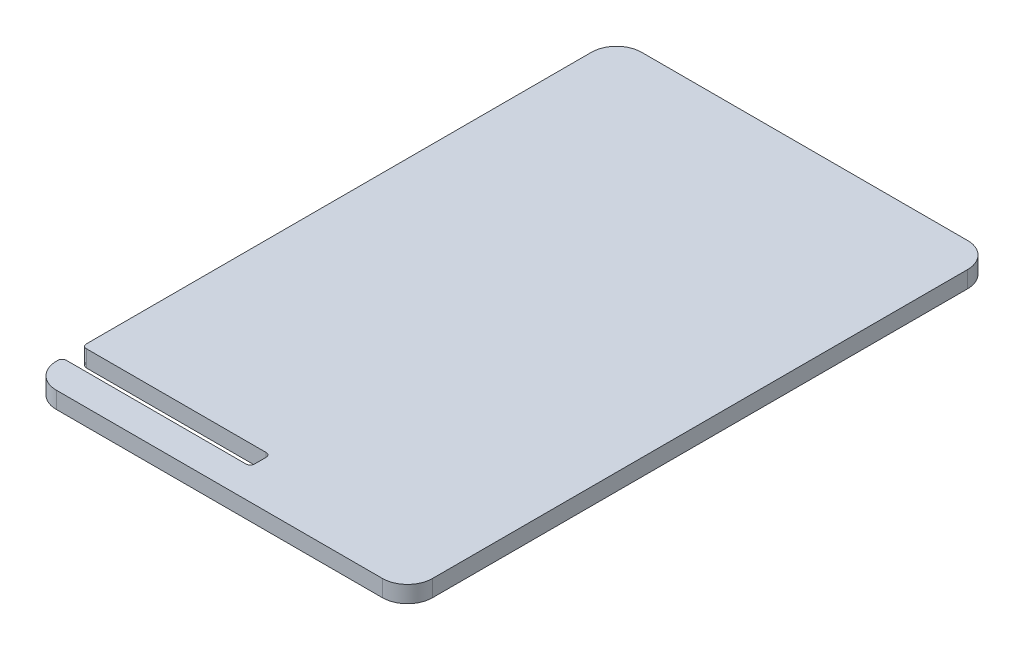
ISO-10303-21;
HEADER;
FILE_DESCRIPTION(('STEP AP214'),'2;1');
FILE_NAME('part.step','',(''),(''),'','','');
FILE_SCHEMA(('AUTOMOTIVE_DESIGN { 1 0 10303 214 1 1 1 1 }'));
ENDSEC;
DATA;
#1=APPLICATION_CONTEXT('core data for automotive mechanical design processes');
#2=APPLICATION_PROTOCOL_DEFINITION('international standard','automotive_design',2000,#1);
#3=PRODUCT_CONTEXT('',#1,'mechanical');
#4=PRODUCT('Part','Part','',(#3));
#5=PRODUCT_RELATED_PRODUCT_CATEGORY('part','',(#4));
#6=PRODUCT_DEFINITION_FORMATION('','',#4);
#7=PRODUCT_DEFINITION_CONTEXT('part definition',#1,'design');
#8=PRODUCT_DEFINITION('design','',#6,#7);
#9=PRODUCT_DEFINITION_SHAPE('','',#8);
#10=(LENGTH_UNIT() NAMED_UNIT(*) SI_UNIT(.MILLI.,.METRE.));
#11=(NAMED_UNIT(*) PLANE_ANGLE_UNIT() SI_UNIT($,.RADIAN.));
#12=(NAMED_UNIT(*) SI_UNIT($,.STERADIAN.) SOLID_ANGLE_UNIT());
#13=UNCERTAINTY_MEASURE_WITH_UNIT(LENGTH_MEASURE(1.E-05),#10,'distance_accuracy_value','');
#14=(GEOMETRIC_REPRESENTATION_CONTEXT(3) GLOBAL_UNCERTAINTY_ASSIGNED_CONTEXT((#13)) GLOBAL_UNIT_ASSIGNED_CONTEXT((#10,
#11,#12)) REPRESENTATION_CONTEXT('',''));
#15=CARTESIAN_POINT('',(0.,0.,0.));
#16=DIRECTION('',(0.,0.,1.));
#17=DIRECTION('',(1.,0.,0.));
#18=AXIS2_PLACEMENT_3D('',#15,#16,#17);
#19=CARTESIAN_POINT('',(-22.5,2.,-35.3062315740794));
#20=DIRECTION('',(1.,0.,0.));
#21=DIRECTION('',(0.,0.,-1.));
#22=AXIS2_PLACEMENT_3D('',#19,#20,#21);
#23=PLANE('',#22);
#24=DIRECTION('',(0.,0.,1.));
#25=VECTOR('',#24,1.);
#26=CARTESIAN_POINT('',(-22.5,0.,-35.3062315740794));
#27=LINE('',#26,#25);
#28=CARTESIAN_POINT('',(-22.5,0.,-32.3062315740794));
#29=VERTEX_POINT('',#28);
#30=CARTESIAN_POINT('',(-22.5,0.,28.1));
#31=VERTEX_POINT('',#30);
#32=EDGE_CURVE('E189',#29,#31,#27,.T.);
#33=ORIENTED_EDGE('',*,*,#32,.T.);
#34=DIRECTION('',(0.,1.,0.));
#35=VECTOR('',#34,1.);
#36=CARTESIAN_POINT('',(-22.5,2.,28.1));
#37=LINE('',#36,#35);
#38=CARTESIAN_POINT('',(-22.5,2.,28.1));
#39=VERTEX_POINT('',#38);
#40=EDGE_CURVE('E349',#31,#39,#37,.T.);
#41=ORIENTED_EDGE('',*,*,#40,.T.);
#42=DIRECTION('',(0.,0.,1.));
#43=VECTOR('',#42,1.);
#44=CARTESIAN_POINT('',(-22.5,2.,-35.3062315740794));
#45=LINE('',#44,#43);
#46=CARTESIAN_POINT('',(-22.5,2.,-32.3062315740794));
#47=VERTEX_POINT('',#46);
#48=EDGE_CURVE('E241',#47,#39,#45,.T.);
#49=ORIENTED_EDGE('',*,*,#48,.F.);
#50=DIRECTION('',(0.,-1.,0.));
#51=VECTOR('',#50,1.);
#52=CARTESIAN_POINT('',(-22.5,2.,-32.3062315740794));
#53=LINE('',#52,#51);
#54=EDGE_CURVE('E262',#47,#29,#53,.T.);
#55=ORIENTED_EDGE('',*,*,#54,.T.);
#56=EDGE_LOOP('',(#33,#41,#49,#55));
#57=FACE_BOUND('',#56,.T.);
#58=ADVANCED_FACE('F46',(#57),#23,.F.);
#59=CARTESIAN_POINT('',(-22.5,2.,31.5));
#60=VERTEX_POINT('',#59);
#61=CARTESIAN_POINT('',(-22.5,2.,31.6937684259206));
#62=VERTEX_POINT('',#61);
#63=EDGE_CURVE('E203',#60,#62,#45,.T.);
#64=ORIENTED_EDGE('',*,*,#63,.F.);
#65=DIRECTION('',(0.,1.,0.));
#66=VECTOR('',#65,1.);
#67=CARTESIAN_POINT('',(-22.5,2.,31.5));
#68=LINE('',#67,#66);
#69=CARTESIAN_POINT('',(-22.5,0.,31.5));
#70=VERTEX_POINT('',#69);
#71=EDGE_CURVE('E367',#60,#70,#68,.F.);
#72=ORIENTED_EDGE('',*,*,#71,.T.);
#73=CARTESIAN_POINT('',(-22.5,0.,31.6937684259206));
#74=VERTEX_POINT('',#73);
#75=EDGE_CURVE('E196',#70,#74,#27,.T.);
#76=ORIENTED_EDGE('',*,*,#75,.T.);
#77=DIRECTION('',(0.,-1.,0.));
#78=VECTOR('',#77,1.);
#79=CARTESIAN_POINT('',(-22.5,2.,31.6937684259206));
#80=LINE('',#79,#78);
#81=EDGE_CURVE('E167',#74,#62,#80,.F.);
#82=ORIENTED_EDGE('',*,*,#81,.T.);
#83=EDGE_LOOP('',(#64,#72,#76,#82));
#84=FACE_BOUND('',#83,.T.);
#85=ADVANCED_FACE('F374',(#84),#23,.F.);
#86=CARTESIAN_POINT('',(-22.5,2.,34.6937684259206));
#87=DIRECTION('',(0.,0.,-1.));
#88=DIRECTION('',(-1.,0.,0.));
#89=AXIS2_PLACEMENT_3D('',#86,#87,#88);
#90=PLANE('',#89);
#91=DIRECTION('',(1.,0.,0.));
#92=VECTOR('',#91,1.);
#93=CARTESIAN_POINT('',(-22.5,2.,34.6937684259206));
#94=LINE('',#93,#92);
#95=CARTESIAN_POINT('',(-19.5,2.,34.6937684259206));
#96=VERTEX_POINT('',#95);
#97=CARTESIAN_POINT('',(19.5,2.,34.6937684259206));
#98=VERTEX_POINT('',#97);
#99=EDGE_CURVE('E180',#96,#98,#94,.T.);
#100=ORIENTED_EDGE('',*,*,#99,.F.);
#101=DIRECTION('',(0.,-1.,0.));
#102=VECTOR('',#101,1.);
#103=CARTESIAN_POINT('',(-19.5,2.,34.6937684259206));
#104=LINE('',#103,#102);
#105=CARTESIAN_POINT('',(-19.5,0.,34.6937684259206));
#106=VERTEX_POINT('',#105);
#107=EDGE_CURVE('E165',#96,#106,#104,.T.);
#108=ORIENTED_EDGE('',*,*,#107,.T.);
#109=DIRECTION('',(1.,0.,0.));
#110=VECTOR('',#109,1.);
#111=CARTESIAN_POINT('',(-22.5,0.,34.6937684259206));
#112=LINE('',#111,#110);
#113=CARTESIAN_POINT('',(19.5,0.,34.6937684259206));
#114=VERTEX_POINT('',#113);
#115=EDGE_CURVE('E177',#106,#114,#112,.T.);
#116=ORIENTED_EDGE('',*,*,#115,.T.);
#117=DIRECTION('',(0.,-1.,0.));
#118=VECTOR('',#117,1.);
#119=CARTESIAN_POINT('',(19.5,2.,34.6937684259206));
#120=LINE('',#119,#118);
#121=EDGE_CURVE('E183',#114,#98,#120,.F.);
#122=ORIENTED_EDGE('',*,*,#121,.T.);
#123=EDGE_LOOP('',(#100,#108,#116,#122));
#124=FACE_BOUND('',#123,.T.);
#125=ADVANCED_FACE('F176',(#124),#90,.F.);
#126=CARTESIAN_POINT('',(22.5,2.,-35.3062315740794));
#127=DIRECTION('',(-1.,0.,0.));
#128=DIRECTION('',(0.,0.,1.));
#129=AXIS2_PLACEMENT_3D('',#126,#127,#128);
#130=PLANE('',#129);
#131=DIRECTION('',(0.,0.,-1.));
#132=VECTOR('',#131,1.);
#133=CARTESIAN_POINT('',(22.5,2.,-35.3062315740794));
#134=LINE('',#133,#132);
#135=CARTESIAN_POINT('',(22.5,2.,31.6937684259206));
#136=VERTEX_POINT('',#135);
#137=CARTESIAN_POINT('',(22.5,2.,-32.3062315740794));
#138=VERTEX_POINT('',#137);
#139=EDGE_CURVE('E233',#136,#138,#134,.T.);
#140=ORIENTED_EDGE('',*,*,#139,.F.);
#141=DIRECTION('',(0.,-1.,0.));
#142=VECTOR('',#141,1.);
#143=CARTESIAN_POINT('',(22.5,2.,31.6937684259206));
#144=LINE('',#143,#142);
#145=CARTESIAN_POINT('',(22.5,0.,31.6937684259206));
#146=VERTEX_POINT('',#145);
#147=EDGE_CURVE('E258',#136,#146,#144,.T.);
#148=ORIENTED_EDGE('',*,*,#147,.T.);
#149=DIRECTION('',(0.,0.,-1.));
#150=VECTOR('',#149,1.);
#151=CARTESIAN_POINT('',(22.5,0.,-35.3062315740794));
#152=LINE('',#151,#150);
#153=CARTESIAN_POINT('',(22.5,0.,-32.3062315740794));
#154=VERTEX_POINT('',#153);
#155=EDGE_CURVE('E188',#146,#154,#152,.T.);
#156=ORIENTED_EDGE('',*,*,#155,.T.);
#157=DIRECTION('',(0.,-1.,0.));
#158=VECTOR('',#157,1.);
#159=CARTESIAN_POINT('',(22.5,2.,-32.3062315740794));
#160=LINE('',#159,#158);
#161=EDGE_CURVE('E255',#154,#138,#160,.F.);
#162=ORIENTED_EDGE('',*,*,#161,.T.);
#163=EDGE_LOOP('',(#140,#148,#156,#162));
#164=FACE_BOUND('',#163,.T.);
#165=ADVANCED_FACE('F530',(#164),#130,.F.);
#166=CARTESIAN_POINT('',(-22.5,2.,-35.3062315740794));
#167=DIRECTION('',(0.,0.,1.));
#168=DIRECTION('',(1.,0.,0.));
#169=AXIS2_PLACEMENT_3D('',#166,#167,#168);
#170=PLANE('',#169);
#171=DIRECTION('',(-1.,0.,0.));
#172=VECTOR('',#171,1.);
#173=CARTESIAN_POINT('',(-22.5,0.,-35.3062315740794));
#174=LINE('',#173,#172);
#175=CARTESIAN_POINT('',(19.5,0.,-35.3062315740794));
#176=VERTEX_POINT('',#175);
#177=CARTESIAN_POINT('',(-19.5,0.,-35.3062315740794));
#178=VERTEX_POINT('',#177);
#179=EDGE_CURVE('E194',#176,#178,#174,.T.);
#180=ORIENTED_EDGE('',*,*,#179,.T.);
#181=DIRECTION('',(0.,-1.,0.));
#182=VECTOR('',#181,1.);
#183=CARTESIAN_POINT('',(-19.5,2.,-35.3062315740794));
#184=LINE('',#183,#182);
#185=CARTESIAN_POINT('',(-19.5,2.,-35.3062315740794));
#186=VERTEX_POINT('',#185);
#187=EDGE_CURVE('E270',#178,#186,#184,.F.);
#188=ORIENTED_EDGE('',*,*,#187,.T.);
#189=DIRECTION('',(-1.,0.,0.));
#190=VECTOR('',#189,1.);
#191=CARTESIAN_POINT('',(-22.5,2.,-35.3062315740794));
#192=LINE('',#191,#190);
#193=CARTESIAN_POINT('',(19.5,2.,-35.3062315740794));
#194=VERTEX_POINT('',#193);
#195=EDGE_CURVE('E205',#194,#186,#192,.T.);
#196=ORIENTED_EDGE('',*,*,#195,.F.);
#197=DIRECTION('',(0.,-1.,0.));
#198=VECTOR('',#197,1.);
#199=CARTESIAN_POINT('',(19.5,2.,-35.3062315740794));
#200=LINE('',#199,#198);
#201=EDGE_CURVE('E266',#194,#176,#200,.T.);
#202=ORIENTED_EDGE('',*,*,#201,.T.);
#203=EDGE_LOOP('',(#180,#188,#196,#202));
#204=FACE_BOUND('',#203,.T.);
#205=ADVANCED_FACE('F483',(#204),#170,.F.);
#206=CARTESIAN_POINT('',(0.,2.,0.));
#207=DIRECTION('',(0.,1.,0.));
#208=DIRECTION('',(0.,0.,1.));
#209=AXIS2_PLACEMENT_3D('',#206,#207,#208);
#210=PLANE('',#209);
#211=DIRECTION('',(1.,0.,0.));
#212=VECTOR('',#211,1.);
#213=CARTESIAN_POINT('',(-22.5,2.,31.));
#214=LINE('',#213,#212);
#215=CARTESIAN_POINT('',(-22.,2.,31.));
#216=VERTEX_POINT('',#215);
#217=CARTESIAN_POINT('',(-0.500000000000007,2.,31.));
#218=VERTEX_POINT('',#217);
#219=EDGE_CURVE('E313',#216,#218,#214,.T.);
#220=ORIENTED_EDGE('',*,*,#219,.F.);
#221=CARTESIAN_POINT('',(-22.,2.,31.5));
#222=DIRECTION('',(0.,1.,0.));
#223=DIRECTION('',(0.,0.,1.));
#224=AXIS2_PLACEMENT_3D('',#221,#222,#223);
#225=CIRCLE('',#224,0.5);
#226=EDGE_CURVE('E284',#216,#60,#225,.T.);
#227=ORIENTED_EDGE('',*,*,#226,.T.);
#228=ORIENTED_EDGE('',*,*,#63,.T.);
#229=CARTESIAN_POINT('',(-19.5,2.,31.6937684259206));
#230=DIRECTION('',(0.,1.,0.));
#231=DIRECTION('',(0.,0.,1.));
#232=AXIS2_PLACEMENT_3D('',#229,#230,#231);
#233=CIRCLE('',#232,3.);
#234=EDGE_CURVE('E251',#62,#96,#233,.T.);
#235=ORIENTED_EDGE('',*,*,#234,.T.);
#236=ORIENTED_EDGE('',*,*,#99,.T.);
#237=CARTESIAN_POINT('',(19.5,2.,31.6937684259206));
#238=DIRECTION('',(0.,1.,0.));
#239=DIRECTION('',(0.,0.,1.));
#240=AXIS2_PLACEMENT_3D('',#237,#238,#239);
#241=CIRCLE('',#240,3.);
#242=EDGE_CURVE('E248',#98,#136,#241,.T.);
#243=ORIENTED_EDGE('',*,*,#242,.T.);
#244=ORIENTED_EDGE('',*,*,#139,.T.);
#245=CARTESIAN_POINT('',(19.5,2.,-32.3062315740794));
#246=DIRECTION('',(0.,1.,0.));
#247=DIRECTION('',(0.,0.,1.));
#248=AXIS2_PLACEMENT_3D('',#245,#246,#247);
#249=CIRCLE('',#248,3.);
#250=EDGE_CURVE('E216',#138,#194,#249,.T.);
#251=ORIENTED_EDGE('',*,*,#250,.T.);
#252=ORIENTED_EDGE('',*,*,#195,.T.);
#253=CARTESIAN_POINT('',(-19.5,2.,-32.3062315740794));
#254=DIRECTION('',(0.,1.,0.));
#255=DIRECTION('',(0.,0.,1.));
#256=AXIS2_PLACEMENT_3D('',#253,#254,#255);
#257=CIRCLE('',#256,3.);
#258=EDGE_CURVE('E220',#186,#47,#257,.T.);
#259=ORIENTED_EDGE('',*,*,#258,.T.);
#260=ORIENTED_EDGE('',*,*,#48,.T.);
#261=CARTESIAN_POINT('',(-22.,2.,28.1));
#262=DIRECTION('',(0.,1.,0.));
#263=DIRECTION('',(0.,0.,1.));
#264=AXIS2_PLACEMENT_3D('',#261,#262,#263);
#265=CIRCLE('',#264,0.5);
#266=CARTESIAN_POINT('',(-22.,2.,28.6));
#267=VERTEX_POINT('',#266);
#268=EDGE_CURVE('E280',#39,#267,#265,.T.);
#269=ORIENTED_EDGE('',*,*,#268,.T.);
#270=DIRECTION('',(-1.,0.,0.));
#271=VECTOR('',#270,1.);
#272=CARTESIAN_POINT('',(-22.5,2.,28.6));
#273=LINE('',#272,#271);
#274=CARTESIAN_POINT('',(-0.500000000000007,2.,28.6));
#275=VERTEX_POINT('',#274);
#276=EDGE_CURVE('E289',#275,#267,#273,.T.);
#277=ORIENTED_EDGE('',*,*,#276,.F.);
#278=CARTESIAN_POINT('',(-0.5,2.,29.1));
#279=DIRECTION('',(0.,1.,0.));
#280=DIRECTION('',(0.,0.,1.));
#281=AXIS2_PLACEMENT_3D('',#278,#279,#280);
#282=CIRCLE('',#281,0.5);
#283=CARTESIAN_POINT('',(0.,2.,29.1));
#284=VERTEX_POINT('',#283);
#285=EDGE_CURVE('E55',#275,#284,#282,.F.);
#286=ORIENTED_EDGE('',*,*,#285,.T.);
#287=DIRECTION('',(0.,0.,-1.));
#288=VECTOR('',#287,1.);
#289=CARTESIAN_POINT('',(0.,2.,28.6));
#290=LINE('',#289,#288);
#291=CARTESIAN_POINT('',(0.,2.,30.5));
#292=VERTEX_POINT('',#291);
#293=EDGE_CURVE('E294',#292,#284,#290,.T.);
#294=ORIENTED_EDGE('',*,*,#293,.F.);
#295=CARTESIAN_POINT('',(-0.5,2.,30.5));
#296=DIRECTION('',(0.,1.,0.));
#297=DIRECTION('',(0.,0.,1.));
#298=AXIS2_PLACEMENT_3D('',#295,#296,#297);
#299=CIRCLE('',#298,0.5);
#300=EDGE_CURVE('E353',#292,#218,#299,.F.);
#301=ORIENTED_EDGE('',*,*,#300,.T.);
#302=EDGE_LOOP('',(#220,#227,#228,#235,#236,#243,#244,#251,#252,#259,#260,#269,#277,#286,#294,#301));
#303=FACE_BOUND('',#302,.T.);
#304=ADVANCED_FACE('F360',(#303),#210,.T.);
#305=CARTESIAN_POINT('',(0.,0.,0.));
#306=DIRECTION('',(0.,1.,0.));
#307=DIRECTION('',(0.,0.,1.));
#308=AXIS2_PLACEMENT_3D('',#305,#306,#307);
#309=PLANE('',#308);
#310=ORIENTED_EDGE('',*,*,#75,.F.);
#311=CARTESIAN_POINT('',(-22.,0.,31.5));
#312=DIRECTION('',(0.,1.,0.));
#313=DIRECTION('',(0.,0.,1.));
#314=AXIS2_PLACEMENT_3D('',#311,#312,#313);
#315=CIRCLE('',#314,0.5);
#316=CARTESIAN_POINT('',(-22.,0.,31.));
#317=VERTEX_POINT('',#316);
#318=EDGE_CURVE('E335',#70,#317,#315,.F.);
#319=ORIENTED_EDGE('',*,*,#318,.T.);
#320=DIRECTION('',(-1.,0.,0.));
#321=VECTOR('',#320,1.);
#322=CARTESIAN_POINT('',(-22.5,0.,31.));
#323=LINE('',#322,#321);
#324=CARTESIAN_POINT('',(-0.5,0.,31.));
#325=VERTEX_POINT('',#324);
#326=EDGE_CURVE('E297',#325,#317,#323,.T.);
#327=ORIENTED_EDGE('',*,*,#326,.F.);
#328=CARTESIAN_POINT('',(-0.5,0.,30.5));
#329=DIRECTION('',(0.,1.,0.));
#330=DIRECTION('',(0.,0.,1.));
#331=AXIS2_PLACEMENT_3D('',#328,#329,#330);
#332=CIRCLE('',#331,0.5);
#333=CARTESIAN_POINT('',(0.,0.,30.5));
#334=VERTEX_POINT('',#333);
#335=EDGE_CURVE('E356',#325,#334,#332,.T.);
#336=ORIENTED_EDGE('',*,*,#335,.T.);
#337=DIRECTION('',(0.,0.,1.));
#338=VECTOR('',#337,1.);
#339=CARTESIAN_POINT('',(0.,0.,28.6));
#340=LINE('',#339,#338);
#341=CARTESIAN_POINT('',(0.,0.,29.1));
#342=VERTEX_POINT('',#341);
#343=EDGE_CURVE('E293',#342,#334,#340,.T.);
#344=ORIENTED_EDGE('',*,*,#343,.F.);
#345=CARTESIAN_POINT('',(-0.5,0.,29.1));
#346=DIRECTION('',(0.,1.,0.));
#347=DIRECTION('',(0.,0.,1.));
#348=AXIS2_PLACEMENT_3D('',#345,#346,#347);
#349=CIRCLE('',#348,0.5);
#350=CARTESIAN_POINT('',(-0.5,0.,28.6));
#351=VERTEX_POINT('',#350);
#352=EDGE_CURVE('E12',#342,#351,#349,.T.);
#353=ORIENTED_EDGE('',*,*,#352,.T.);
#354=DIRECTION('',(1.,0.,0.));
#355=VECTOR('',#354,1.);
#356=CARTESIAN_POINT('',(-22.5,0.,28.6));
#357=LINE('',#356,#355);
#358=CARTESIAN_POINT('',(-22.,0.,28.6));
#359=VERTEX_POINT('',#358);
#360=EDGE_CURVE('E300',#359,#351,#357,.T.);
#361=ORIENTED_EDGE('',*,*,#360,.F.);
#362=CARTESIAN_POINT('',(-22.,0.,28.1));
#363=DIRECTION('',(0.,1.,0.));
#364=DIRECTION('',(0.,0.,1.));
#365=AXIS2_PLACEMENT_3D('',#362,#363,#364);
#366=CIRCLE('',#365,0.5);
#367=EDGE_CURVE('E62',#359,#31,#366,.F.);
#368=ORIENTED_EDGE('',*,*,#367,.T.);
#369=ORIENTED_EDGE('',*,*,#32,.F.);
#370=CARTESIAN_POINT('',(-19.5,0.,-32.3062315740794));
#371=DIRECTION('',(0.,1.,0.));
#372=DIRECTION('',(0.,0.,1.));
#373=AXIS2_PLACEMENT_3D('',#370,#371,#372);
#374=CIRCLE('',#373,3.);
#375=EDGE_CURVE('E209',#29,#178,#374,.F.);
#376=ORIENTED_EDGE('',*,*,#375,.T.);
#377=ORIENTED_EDGE('',*,*,#179,.F.);
#378=CARTESIAN_POINT('',(19.5,0.,-32.3062315740794));
#379=DIRECTION('',(0.,1.,0.));
#380=DIRECTION('',(0.,0.,1.));
#381=AXIS2_PLACEMENT_3D('',#378,#379,#380);
#382=CIRCLE('',#381,3.);
#383=EDGE_CURVE('E182',#176,#154,#382,.F.);
#384=ORIENTED_EDGE('',*,*,#383,.T.);
#385=ORIENTED_EDGE('',*,*,#155,.F.);
#386=CARTESIAN_POINT('',(19.5,0.,31.6937684259206));
#387=DIRECTION('',(0.,1.,0.));
#388=DIRECTION('',(0.,0.,1.));
#389=AXIS2_PLACEMENT_3D('',#386,#387,#388);
#390=CIRCLE('',#389,3.);
#391=EDGE_CURVE('E171',#146,#114,#390,.F.);
#392=ORIENTED_EDGE('',*,*,#391,.T.);
#393=ORIENTED_EDGE('',*,*,#115,.F.);
#394=CARTESIAN_POINT('',(-19.5,0.,31.6937684259206));
#395=DIRECTION('',(0.,1.,0.));
#396=DIRECTION('',(0.,0.,1.));
#397=AXIS2_PLACEMENT_3D('',#394,#395,#396);
#398=CIRCLE('',#397,3.);
#399=EDGE_CURVE('E161',#106,#74,#398,.F.);
#400=ORIENTED_EDGE('',*,*,#399,.T.);
#401=EDGE_LOOP('',(#310,#319,#327,#336,#344,#353,#361,#368,#369,#376,#377,#384,#385,#392,#393,#400));
#402=FACE_BOUND('',#401,.T.);
#403=ADVANCED_FACE('F185',(#402),#309,.F.);
#404=CARTESIAN_POINT('',(-22.5,-22.6276379677597,28.6));
#405=DIRECTION('',(0.,0.,-1.));
#406=DIRECTION('',(-1.,0.,0.));
#407=AXIS2_PLACEMENT_3D('',#404,#405,#406);
#408=PLANE('',#407);
#409=ORIENTED_EDGE('',*,*,#360,.T.);
#410=DIRECTION('',(0.,1.,0.));
#411=VECTOR('',#410,1.);
#412=CARTESIAN_POINT('',(-0.5,2.,28.6));
#413=LINE('',#412,#411);
#414=EDGE_CURVE('E346',#351,#275,#413,.T.);
#415=ORIENTED_EDGE('',*,*,#414,.T.);
#416=ORIENTED_EDGE('',*,*,#276,.T.);
#417=DIRECTION('',(0.,1.,0.));
#418=VECTOR('',#417,1.);
#419=CARTESIAN_POINT('',(-22.,-22.6276379677597,28.6));
#420=LINE('',#419,#418);
#421=EDGE_CURVE('E339',#267,#359,#420,.F.);
#422=ORIENTED_EDGE('',*,*,#421,.T.);
#423=EDGE_LOOP('',(#409,#415,#416,#422));
#424=FACE_BOUND('',#423,.T.);
#425=ADVANCED_FACE('F363',(#424),#408,.F.);
#426=CARTESIAN_POINT('',(0.,-22.6276379677597,28.6));
#427=DIRECTION('',(1.,0.,0.));
#428=DIRECTION('',(0.,0.,-1.));
#429=AXIS2_PLACEMENT_3D('',#426,#427,#428);
#430=PLANE('',#429);
#431=ORIENTED_EDGE('',*,*,#343,.T.);
#432=DIRECTION('',(0.,1.,0.));
#433=VECTOR('',#432,1.);
#434=CARTESIAN_POINT('',(0.,2.,30.5));
#435=LINE('',#434,#433);
#436=EDGE_CURVE('E330',#334,#292,#435,.T.);
#437=ORIENTED_EDGE('',*,*,#436,.T.);
#438=ORIENTED_EDGE('',*,*,#293,.T.);
#439=DIRECTION('',(0.,1.,0.));
#440=VECTOR('',#439,1.);
#441=CARTESIAN_POINT('',(0.,0.,29.1));
#442=LINE('',#441,#440);
#443=EDGE_CURVE('E328',#284,#342,#442,.F.);
#444=ORIENTED_EDGE('',*,*,#443,.T.);
#445=EDGE_LOOP('',(#431,#437,#438,#444));
#446=FACE_BOUND('',#445,.T.);
#447=ADVANCED_FACE('F327',(#446),#430,.F.);
#448=CARTESIAN_POINT('',(-22.5,-22.6276379677597,31.));
#449=DIRECTION('',(0.,0.,1.));
#450=DIRECTION('',(1.,0.,0.));
#451=AXIS2_PLACEMENT_3D('',#448,#449,#450);
#452=PLANE('',#451);
#453=ORIENTED_EDGE('',*,*,#326,.T.);
#454=DIRECTION('',(0.,1.,0.));
#455=VECTOR('',#454,1.);
#456=CARTESIAN_POINT('',(-22.,-22.6276379677597,31.));
#457=LINE('',#456,#455);
#458=EDGE_CURVE('E276',#317,#216,#457,.T.);
#459=ORIENTED_EDGE('',*,*,#458,.T.);
#460=ORIENTED_EDGE('',*,*,#219,.T.);
#461=DIRECTION('',(0.,1.,0.));
#462=VECTOR('',#461,1.);
#463=CARTESIAN_POINT('',(-0.5,0.,31.));
#464=LINE('',#463,#462);
#465=EDGE_CURVE('E273',#218,#325,#464,.F.);
#466=ORIENTED_EDGE('',*,*,#465,.T.);
#467=EDGE_LOOP('',(#453,#459,#460,#466));
#468=FACE_BOUND('',#467,.T.);
#469=ADVANCED_FACE('F381',(#468),#452,.F.);
#470=CARTESIAN_POINT('',(-19.5,2.,31.6937684259206));
#471=DIRECTION('',(0.,-1.,0.));
#472=DIRECTION('',(0.,0.,-1.));
#473=AXIS2_PLACEMENT_3D('',#470,#471,#472);
#474=CYLINDRICAL_SURFACE('',#473,3.);
#475=ORIENTED_EDGE('',*,*,#234,.F.);
#476=ORIENTED_EDGE('',*,*,#81,.F.);
#477=ORIENTED_EDGE('',*,*,#399,.F.);
#478=ORIENTED_EDGE('',*,*,#107,.F.);
#479=EDGE_LOOP('',(#475,#476,#477,#478));
#480=FACE_BOUND('',#479,.T.);
#481=ADVANCED_FACE('F164',(#480),#474,.T.);
#482=CARTESIAN_POINT('',(19.5,2.,31.6937684259206));
#483=DIRECTION('',(0.,-1.,0.));
#484=DIRECTION('',(0.,0.,-1.));
#485=AXIS2_PLACEMENT_3D('',#482,#483,#484);
#486=CYLINDRICAL_SURFACE('',#485,3.);
#487=ORIENTED_EDGE('',*,*,#242,.F.);
#488=ORIENTED_EDGE('',*,*,#121,.F.);
#489=ORIENTED_EDGE('',*,*,#391,.F.);
#490=ORIENTED_EDGE('',*,*,#147,.F.);
#491=EDGE_LOOP('',(#487,#488,#489,#490));
#492=FACE_BOUND('',#491,.T.);
#493=ADVANCED_FACE('F388',(#492),#486,.T.);
#494=CARTESIAN_POINT('',(-19.5,2.,-32.3062315740794));
#495=DIRECTION('',(0.,-1.,0.));
#496=DIRECTION('',(0.,0.,-1.));
#497=AXIS2_PLACEMENT_3D('',#494,#495,#496);
#498=CYLINDRICAL_SURFACE('',#497,3.);
#499=ORIENTED_EDGE('',*,*,#258,.F.);
#500=ORIENTED_EDGE('',*,*,#187,.F.);
#501=ORIENTED_EDGE('',*,*,#375,.F.);
#502=ORIENTED_EDGE('',*,*,#54,.F.);
#503=EDGE_LOOP('',(#499,#500,#501,#502));
#504=FACE_BOUND('',#503,.T.);
#505=ADVANCED_FACE('F403',(#504),#498,.T.);
#506=CARTESIAN_POINT('',(19.5,2.,-32.3062315740794));
#507=DIRECTION('',(0.,-1.,0.));
#508=DIRECTION('',(0.,0.,-1.));
#509=AXIS2_PLACEMENT_3D('',#506,#507,#508);
#510=CYLINDRICAL_SURFACE('',#509,3.);
#511=ORIENTED_EDGE('',*,*,#250,.F.);
#512=ORIENTED_EDGE('',*,*,#161,.F.);
#513=ORIENTED_EDGE('',*,*,#383,.F.);
#514=ORIENTED_EDGE('',*,*,#201,.F.);
#515=EDGE_LOOP('',(#511,#512,#513,#514));
#516=FACE_BOUND('',#515,.T.);
#517=ADVANCED_FACE('F407',(#516),#510,.T.);
#518=CARTESIAN_POINT('',(-22.,-22.6276379677597,31.5));
#519=DIRECTION('',(0.,1.,0.));
#520=DIRECTION('',(0.,0.,1.));
#521=AXIS2_PLACEMENT_3D('',#518,#519,#520);
#522=CYLINDRICAL_SURFACE('',#521,0.5);
#523=ORIENTED_EDGE('',*,*,#318,.F.);
#524=ORIENTED_EDGE('',*,*,#71,.F.);
#525=ORIENTED_EDGE('',*,*,#226,.F.);
#526=ORIENTED_EDGE('',*,*,#458,.F.);
#527=EDGE_LOOP('',(#523,#524,#525,#526));
#528=FACE_BOUND('',#527,.T.);
#529=ADVANCED_FACE('F377',(#528),#522,.T.);
#530=CARTESIAN_POINT('',(-0.5,-22.6276379677597,30.5));
#531=DIRECTION('',(0.,-1.,0.));
#532=DIRECTION('',(0.,0.,-1.));
#533=AXIS2_PLACEMENT_3D('',#530,#531,#532);
#534=CYLINDRICAL_SURFACE('',#533,0.5);
#535=ORIENTED_EDGE('',*,*,#335,.F.);
#536=ORIENTED_EDGE('',*,*,#465,.F.);
#537=ORIENTED_EDGE('',*,*,#300,.F.);
#538=ORIENTED_EDGE('',*,*,#436,.F.);
#539=EDGE_LOOP('',(#535,#536,#537,#538));
#540=FACE_BOUND('',#539,.T.);
#541=ADVANCED_FACE('F380',(#540),#534,.F.);
#542=CARTESIAN_POINT('',(-0.5,-22.6276379677597,29.1));
#543=DIRECTION('',(0.,-1.,0.));
#544=DIRECTION('',(0.,0.,-1.));
#545=AXIS2_PLACEMENT_3D('',#542,#543,#544);
#546=CYLINDRICAL_SURFACE('',#545,0.5);
#547=ORIENTED_EDGE('',*,*,#352,.F.);
#548=ORIENTED_EDGE('',*,*,#443,.F.);
#549=ORIENTED_EDGE('',*,*,#285,.F.);
#550=ORIENTED_EDGE('',*,*,#414,.F.);
#551=EDGE_LOOP('',(#547,#548,#549,#550));
#552=FACE_BOUND('',#551,.T.);
#553=ADVANCED_FACE('F333',(#552),#546,.F.);
#554=CARTESIAN_POINT('',(-22.,2.,28.1));
#555=DIRECTION('',(0.,1.,0.));
#556=DIRECTION('',(0.,0.,1.));
#557=AXIS2_PLACEMENT_3D('',#554,#555,#556);
#558=CYLINDRICAL_SURFACE('',#557,0.5);
#559=ORIENTED_EDGE('',*,*,#367,.F.);
#560=ORIENTED_EDGE('',*,*,#421,.F.);
#561=ORIENTED_EDGE('',*,*,#268,.F.);
#562=ORIENTED_EDGE('',*,*,#40,.F.);
#563=EDGE_LOOP('',(#559,#560,#561,#562));
#564=FACE_BOUND('',#563,.T.);
#565=ADVANCED_FACE('F48',(#564),#558,.T.);
#566=CLOSED_SHELL('',(#58,#85,#125,#165,#205,#304,#403,#425,#447,#469,#481,#493,#505,#517,#529,
#541,#553,#565));
#567=MANIFOLD_SOLID_BREP('B2',#566);
#568=ADVANCED_BREP_SHAPE_REPRESENTATION('',(#18,#567),#14);
#569=SHAPE_DEFINITION_REPRESENTATION(#9,#568);
ENDSEC;
END-ISO-10303-21;
